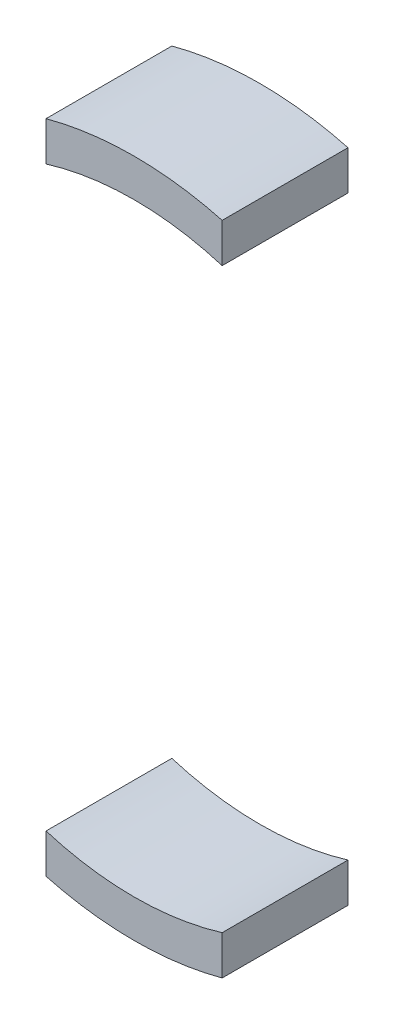
ISO-10303-21;
HEADER;
FILE_DESCRIPTION(('STEP AP214'),'2;1');
FILE_NAME('part.step','',(''),(''),'','','');
FILE_SCHEMA(('AUTOMOTIVE_DESIGN { 1 0 10303 214 1 1 1 1 }'));
ENDSEC;
DATA;
#1=APPLICATION_CONTEXT('core data for automotive mechanical design processes');
#2=APPLICATION_PROTOCOL_DEFINITION('international standard','automotive_design',2000,#1);
#3=PRODUCT_CONTEXT('',#1,'mechanical');
#4=PRODUCT('Part','Part','',(#3));
#5=PRODUCT_RELATED_PRODUCT_CATEGORY('part','',(#4));
#6=PRODUCT_DEFINITION_FORMATION('','',#4);
#7=PRODUCT_DEFINITION_CONTEXT('part definition',#1,'design');
#8=PRODUCT_DEFINITION('design','',#6,#7);
#9=PRODUCT_DEFINITION_SHAPE('','',#8);
#10=(LENGTH_UNIT() NAMED_UNIT(*) SI_UNIT(.MILLI.,.METRE.));
#11=(NAMED_UNIT(*) PLANE_ANGLE_UNIT() SI_UNIT($,.RADIAN.));
#12=(NAMED_UNIT(*) SI_UNIT($,.STERADIAN.) SOLID_ANGLE_UNIT());
#13=UNCERTAINTY_MEASURE_WITH_UNIT(LENGTH_MEASURE(1.E-05),#10,'distance_accuracy_value','');
#14=(GEOMETRIC_REPRESENTATION_CONTEXT(3) GLOBAL_UNCERTAINTY_ASSIGNED_CONTEXT((#13)) GLOBAL_UNIT_ASSIGNED_CONTEXT((#10,
#11,#12)) REPRESENTATION_CONTEXT('',''));
#15=CARTESIAN_POINT('',(0.,0.,0.));
#16=DIRECTION('',(0.,0.,1.));
#17=DIRECTION('',(1.,0.,0.));
#18=AXIS2_PLACEMENT_3D('',#15,#16,#17);
#19=CARTESIAN_POINT('',(0.,0.,2.5));
#20=DIRECTION('',(0.,0.,-1.));
#21=DIRECTION('',(-1.,0.,0.));
#22=AXIS2_PLACEMENT_3D('',#19,#20,#21);
#23=CYLINDRICAL_SURFACE('',#22,6.);
#24=CARTESIAN_POINT('',(0.,0.,0.));
#25=DIRECTION('',(0.,0.,-1.));
#26=DIRECTION('',(1.,0.,0.));
#27=AXIS2_PLACEMENT_3D('',#24,#25,#26);
#28=CIRCLE('',#27,6.);
#29=CARTESIAN_POINT('',(-1.75,5.7391201416245,0.));
#30=VERTEX_POINT('',#29);
#31=CARTESIAN_POINT('',(1.75,5.7391201416245,0.));
#32=VERTEX_POINT('',#31);
#33=EDGE_CURVE('E12',#30,#32,#28,.T.);
#34=ORIENTED_EDGE('',*,*,#33,.T.);
#35=DIRECTION('',(0.,0.,-1.));
#36=VECTOR('',#35,1.);
#37=CARTESIAN_POINT('',(1.75,5.7391201416245,2.5));
#38=LINE('',#37,#36);
#39=CARTESIAN_POINT('',(1.75,5.7391201416245,2.5));
#40=VERTEX_POINT('',#39);
#41=EDGE_CURVE('E135',#40,#32,#38,.T.);
#42=ORIENTED_EDGE('',*,*,#41,.F.);
#43=CARTESIAN_POINT('',(0.,0.,2.5));
#44=DIRECTION('',(0.,0.,-1.));
#45=DIRECTION('',(1.,0.,0.));
#46=AXIS2_PLACEMENT_3D('',#43,#44,#45);
#47=CIRCLE('',#46,6.);
#48=CARTESIAN_POINT('',(-1.75,5.7391201416245,2.5));
#49=VERTEX_POINT('',#48);
#50=EDGE_CURVE('E59',#49,#40,#47,.T.);
#51=ORIENTED_EDGE('',*,*,#50,.F.);
#52=DIRECTION('',(0.,0.,-1.));
#53=VECTOR('',#52,1.);
#54=CARTESIAN_POINT('',(-1.75,5.7391201416245,2.5));
#55=LINE('',#54,#53);
#56=EDGE_CURVE('E117',#49,#30,#55,.T.);
#57=ORIENTED_EDGE('',*,*,#56,.T.);
#58=EDGE_LOOP('',(#34,#42,#51,#57));
#59=FACE_BOUND('',#58,.T.);
#60=ADVANCED_FACE('F55',(#59),#23,.F.);
#61=CARTESIAN_POINT('',(1.75,6.51920240520265,2.5));
#62=DIRECTION('',(-1.,0.,0.));
#63=DIRECTION('',(0.,0.,1.));
#64=AXIS2_PLACEMENT_3D('',#61,#62,#63);
#65=PLANE('',#64);
#66=DIRECTION('',(0.,1.,0.));
#67=VECTOR('',#66,1.);
#68=CARTESIAN_POINT('',(1.75,6.51920240520265,0.));
#69=LINE('',#68,#67);
#70=CARTESIAN_POINT('',(1.75,6.51920240520265,0.));
#71=VERTEX_POINT('',#70);
#72=EDGE_CURVE('E66',#32,#71,#69,.T.);
#73=ORIENTED_EDGE('',*,*,#72,.T.);
#74=DIRECTION('',(0.,0.,-1.));
#75=VECTOR('',#74,1.);
#76=CARTESIAN_POINT('',(1.75,6.51920240520265,2.5));
#77=LINE('',#76,#75);
#78=CARTESIAN_POINT('',(1.75,6.51920240520265,2.5));
#79=VERTEX_POINT('',#78);
#80=EDGE_CURVE('E111',#79,#71,#77,.T.);
#81=ORIENTED_EDGE('',*,*,#80,.F.);
#82=DIRECTION('',(0.,1.,0.));
#83=VECTOR('',#82,1.);
#84=CARTESIAN_POINT('',(1.75,6.51920240520265,2.5));
#85=LINE('',#84,#83);
#86=EDGE_CURVE('E90',#40,#79,#85,.T.);
#87=ORIENTED_EDGE('',*,*,#86,.F.);
#88=ORIENTED_EDGE('',*,*,#41,.T.);
#89=EDGE_LOOP('',(#73,#81,#87,#88));
#90=FACE_BOUND('',#89,.T.);
#91=ADVANCED_FACE('F139',(#90),#65,.F.);
#92=CARTESIAN_POINT('',(0.,0.,2.5));
#93=DIRECTION('',(0.,0.,-1.));
#94=DIRECTION('',(-1.,0.,0.));
#95=AXIS2_PLACEMENT_3D('',#92,#93,#94);
#96=CYLINDRICAL_SURFACE('',#95,6.75);
#97=CARTESIAN_POINT('',(0.,0.,0.));
#98=DIRECTION('',(0.,0.,1.));
#99=DIRECTION('',(1.,0.,0.));
#100=AXIS2_PLACEMENT_3D('',#97,#98,#99);
#101=CIRCLE('',#100,6.75);
#102=CARTESIAN_POINT('',(-1.75,6.51920240520265,0.));
#103=VERTEX_POINT('',#102);
#104=EDGE_CURVE('E106',#71,#103,#101,.T.);
#105=ORIENTED_EDGE('',*,*,#104,.T.);
#106=DIRECTION('',(0.,0.,-1.));
#107=VECTOR('',#106,1.);
#108=CARTESIAN_POINT('',(-1.75,6.51920240520265,2.5));
#109=LINE('',#108,#107);
#110=CARTESIAN_POINT('',(-1.75,6.51920240520265,2.5));
#111=VERTEX_POINT('',#110);
#112=EDGE_CURVE('E109',#111,#103,#109,.T.);
#113=ORIENTED_EDGE('',*,*,#112,.F.);
#114=CARTESIAN_POINT('',(0.,0.,2.5));
#115=DIRECTION('',(0.,0.,1.));
#116=DIRECTION('',(1.,0.,0.));
#117=AXIS2_PLACEMENT_3D('',#114,#115,#116);
#118=CIRCLE('',#117,6.75);
#119=EDGE_CURVE('E129',#79,#111,#118,.T.);
#120=ORIENTED_EDGE('',*,*,#119,.F.);
#121=ORIENTED_EDGE('',*,*,#80,.T.);
#122=EDGE_LOOP('',(#105,#113,#120,#121));
#123=FACE_BOUND('',#122,.T.);
#124=ADVANCED_FACE('F107',(#123),#96,.T.);
#125=CARTESIAN_POINT('',(-1.75,6.51920240520265,2.5));
#126=DIRECTION('',(1.,0.,0.));
#127=DIRECTION('',(0.,0.,-1.));
#128=AXIS2_PLACEMENT_3D('',#125,#126,#127);
#129=PLANE('',#128);
#130=DIRECTION('',(0.,-1.,0.));
#131=VECTOR('',#130,1.);
#132=CARTESIAN_POINT('',(-1.75,6.51920240520265,0.));
#133=LINE('',#132,#131);
#134=EDGE_CURVE('E100',#103,#30,#133,.T.);
#135=ORIENTED_EDGE('',*,*,#134,.T.);
#136=ORIENTED_EDGE('',*,*,#56,.F.);
#137=DIRECTION('',(0.,-1.,0.));
#138=VECTOR('',#137,1.);
#139=CARTESIAN_POINT('',(-1.75,6.51920240520265,2.5));
#140=LINE('',#139,#138);
#141=EDGE_CURVE('E115',#111,#49,#140,.T.);
#142=ORIENTED_EDGE('',*,*,#141,.F.);
#143=ORIENTED_EDGE('',*,*,#112,.T.);
#144=EDGE_LOOP('',(#135,#136,#142,#143));
#145=FACE_BOUND('',#144,.T.);
#146=ADVANCED_FACE('F114',(#145),#129,.F.);
#147=CARTESIAN_POINT('',(0.,0.,2.5));
#148=DIRECTION('',(0.,0.,1.));
#149=DIRECTION('',(1.,0.,0.));
#150=AXIS2_PLACEMENT_3D('',#147,#148,#149);
#151=PLANE('',#150);
#152=ORIENTED_EDGE('',*,*,#50,.T.);
#153=ORIENTED_EDGE('',*,*,#86,.T.);
#154=ORIENTED_EDGE('',*,*,#119,.T.);
#155=ORIENTED_EDGE('',*,*,#141,.T.);
#156=EDGE_LOOP('',(#152,#153,#154,#155));
#157=FACE_BOUND('',#156,.T.);
#158=ADVANCED_FACE('F57',(#157),#151,.T.);
#159=CARTESIAN_POINT('',(0.,0.,0.));
#160=DIRECTION('',(0.,0.,1.));
#161=DIRECTION('',(1.,0.,0.));
#162=AXIS2_PLACEMENT_3D('',#159,#160,#161);
#163=PLANE('',#162);
#164=ORIENTED_EDGE('',*,*,#33,.F.);
#165=ORIENTED_EDGE('',*,*,#134,.F.);
#166=ORIENTED_EDGE('',*,*,#104,.F.);
#167=ORIENTED_EDGE('',*,*,#72,.F.);
#168=EDGE_LOOP('',(#164,#165,#166,#167));
#169=FACE_BOUND('',#168,.T.);
#170=ADVANCED_FACE('F119',(#169),#163,.F.);
#171=CLOSED_SHELL('',(#60,#91,#124,#146,#158,#170));
#172=MANIFOLD_SOLID_BREP('B2',#171);
#173=CARTESIAN_POINT('',(0.,0.,2.5));
#174=DIRECTION('',(0.,0.,-1.));
#175=DIRECTION('',(-1.,0.,0.));
#176=AXIS2_PLACEMENT_3D('',#173,#174,#175);
#177=CYLINDRICAL_SURFACE('',#176,6.);
#178=CARTESIAN_POINT('',(0.,0.,0.));
#179=DIRECTION('',(0.,0.,-1.));
#180=DIRECTION('',(1.,0.,0.));
#181=AXIS2_PLACEMENT_3D('',#178,#179,#180);
#182=CIRCLE('',#181,6.);
#183=CARTESIAN_POINT('',(1.75,-5.7391201416245,0.));
#184=VERTEX_POINT('',#183);
#185=CARTESIAN_POINT('',(-1.75,-5.7391201416245,0.));
#186=VERTEX_POINT('',#185);
#187=EDGE_CURVE('E254',#184,#186,#182,.T.);
#188=ORIENTED_EDGE('',*,*,#187,.T.);
#189=DIRECTION('',(0.,0.,-1.));
#190=VECTOR('',#189,1.);
#191=CARTESIAN_POINT('',(-1.75,-5.7391201416245,2.5));
#192=LINE('',#191,#190);
#193=CARTESIAN_POINT('',(-1.75,-5.7391201416245,2.5));
#194=VERTEX_POINT('',#193);
#195=EDGE_CURVE('E53',#194,#186,#192,.T.);
#196=ORIENTED_EDGE('',*,*,#195,.F.);
#197=CARTESIAN_POINT('',(0.,0.,2.5));
#198=DIRECTION('',(0.,0.,-1.));
#199=DIRECTION('',(1.,0.,0.));
#200=AXIS2_PLACEMENT_3D('',#197,#198,#199);
#201=CIRCLE('',#200,6.);
#202=CARTESIAN_POINT('',(1.75,-5.7391201416245,2.5));
#203=VERTEX_POINT('',#202);
#204=EDGE_CURVE('E242',#203,#194,#201,.T.);
#205=ORIENTED_EDGE('',*,*,#204,.F.);
#206=DIRECTION('',(0.,0.,-1.));
#207=VECTOR('',#206,1.);
#208=CARTESIAN_POINT('',(1.75,-5.7391201416245,2.5));
#209=LINE('',#208,#207);
#210=EDGE_CURVE('E250',#203,#184,#209,.T.);
#211=ORIENTED_EDGE('',*,*,#210,.T.);
#212=EDGE_LOOP('',(#188,#196,#205,#211));
#213=FACE_BOUND('',#212,.T.);
#214=ADVANCED_FACE('F191',(#213),#177,.F.);
#215=CARTESIAN_POINT('',(-1.75,-5.7391201416245,2.5));
#216=DIRECTION('',(1.,0.,0.));
#217=DIRECTION('',(0.,0.,-1.));
#218=AXIS2_PLACEMENT_3D('',#215,#216,#217);
#219=PLANE('',#218);
#220=DIRECTION('',(0.,-1.,0.));
#221=VECTOR('',#220,1.);
#222=CARTESIAN_POINT('',(-1.75,-5.7391201416245,0.));
#223=LINE('',#222,#221);
#224=CARTESIAN_POINT('',(-1.75,-6.51920240520265,0.));
#225=VERTEX_POINT('',#224);
#226=EDGE_CURVE('E246',#186,#225,#223,.T.);
#227=ORIENTED_EDGE('',*,*,#226,.T.);
#228=DIRECTION('',(0.,0.,-1.));
#229=VECTOR('',#228,1.);
#230=CARTESIAN_POINT('',(-1.75,-6.51920240520265,2.5));
#231=LINE('',#230,#229);
#232=CARTESIAN_POINT('',(-1.75,-6.51920240520265,2.5));
#233=VERTEX_POINT('',#232);
#234=EDGE_CURVE('E199',#233,#225,#231,.T.);
#235=ORIENTED_EDGE('',*,*,#234,.F.);
#236=DIRECTION('',(0.,-1.,0.));
#237=VECTOR('',#236,1.);
#238=CARTESIAN_POINT('',(-1.75,-5.7391201416245,2.5));
#239=LINE('',#238,#237);
#240=EDGE_CURVE('E237',#194,#233,#239,.T.);
#241=ORIENTED_EDGE('',*,*,#240,.F.);
#242=ORIENTED_EDGE('',*,*,#195,.T.);
#243=EDGE_LOOP('',(#227,#235,#241,#242));
#244=FACE_BOUND('',#243,.T.);
#245=ADVANCED_FACE('F245',(#244),#219,.F.);
#246=CARTESIAN_POINT('',(0.,0.,2.5));
#247=DIRECTION('',(0.,0.,-1.));
#248=DIRECTION('',(-1.,0.,0.));
#249=AXIS2_PLACEMENT_3D('',#246,#247,#248);
#250=CYLINDRICAL_SURFACE('',#249,6.75);
#251=CARTESIAN_POINT('',(0.,0.,0.));
#252=DIRECTION('',(0.,0.,1.));
#253=DIRECTION('',(1.,0.,0.));
#254=AXIS2_PLACEMENT_3D('',#251,#252,#253);
#255=CIRCLE('',#254,6.75);
#256=CARTESIAN_POINT('',(1.75,-6.51920240520265,0.));
#257=VERTEX_POINT('',#256);
#258=EDGE_CURVE('E224',#225,#257,#255,.T.);
#259=ORIENTED_EDGE('',*,*,#258,.T.);
#260=DIRECTION('',(0.,0.,-1.));
#261=VECTOR('',#260,1.);
#262=CARTESIAN_POINT('',(1.75,-6.51920240520265,2.5));
#263=LINE('',#262,#261);
#264=CARTESIAN_POINT('',(1.75,-6.51920240520265,2.5));
#265=VERTEX_POINT('',#264);
#266=EDGE_CURVE('E247',#265,#257,#263,.T.);
#267=ORIENTED_EDGE('',*,*,#266,.F.);
#268=CARTESIAN_POINT('',(0.,0.,2.5));
#269=DIRECTION('',(0.,0.,1.));
#270=DIRECTION('',(1.,0.,0.));
#271=AXIS2_PLACEMENT_3D('',#268,#269,#270);
#272=CIRCLE('',#271,6.75);
#273=EDGE_CURVE('E240',#233,#265,#272,.T.);
#274=ORIENTED_EDGE('',*,*,#273,.F.);
#275=ORIENTED_EDGE('',*,*,#234,.T.);
#276=EDGE_LOOP('',(#259,#267,#274,#275));
#277=FACE_BOUND('',#276,.T.);
#278=ADVANCED_FACE('F248',(#277),#250,.T.);
#279=CARTESIAN_POINT('',(1.75,-5.7391201416245,2.5));
#280=DIRECTION('',(-1.,0.,0.));
#281=DIRECTION('',(0.,0.,1.));
#282=AXIS2_PLACEMENT_3D('',#279,#280,#281);
#283=PLANE('',#282);
#284=DIRECTION('',(0.,1.,0.));
#285=VECTOR('',#284,1.);
#286=CARTESIAN_POINT('',(1.75,-5.7391201416245,0.));
#287=LINE('',#286,#285);
#288=EDGE_CURVE('E230',#257,#184,#287,.T.);
#289=ORIENTED_EDGE('',*,*,#288,.T.);
#290=ORIENTED_EDGE('',*,*,#210,.F.);
#291=DIRECTION('',(0.,1.,0.));
#292=VECTOR('',#291,1.);
#293=CARTESIAN_POINT('',(1.75,-5.7391201416245,2.5));
#294=LINE('',#293,#292);
#295=EDGE_CURVE('E207',#265,#203,#294,.T.);
#296=ORIENTED_EDGE('',*,*,#295,.F.);
#297=ORIENTED_EDGE('',*,*,#266,.T.);
#298=EDGE_LOOP('',(#289,#290,#296,#297));
#299=FACE_BOUND('',#298,.T.);
#300=ADVANCED_FACE('F261',(#299),#283,.F.);
#301=CARTESIAN_POINT('',(0.,0.,2.5));
#302=DIRECTION('',(0.,0.,1.));
#303=DIRECTION('',(1.,0.,0.));
#304=AXIS2_PLACEMENT_3D('',#301,#302,#303);
#305=PLANE('',#304);
#306=ORIENTED_EDGE('',*,*,#204,.T.);
#307=ORIENTED_EDGE('',*,*,#240,.T.);
#308=ORIENTED_EDGE('',*,*,#273,.T.);
#309=ORIENTED_EDGE('',*,*,#295,.T.);
#310=EDGE_LOOP('',(#306,#307,#308,#309));
#311=FACE_BOUND('',#310,.T.);
#312=ADVANCED_FACE('F238',(#311),#305,.T.);
#313=CARTESIAN_POINT('',(0.,0.,0.));
#314=DIRECTION('',(0.,0.,1.));
#315=DIRECTION('',(1.,0.,0.));
#316=AXIS2_PLACEMENT_3D('',#313,#314,#315);
#317=PLANE('',#316);
#318=ORIENTED_EDGE('',*,*,#187,.F.);
#319=ORIENTED_EDGE('',*,*,#288,.F.);
#320=ORIENTED_EDGE('',*,*,#258,.F.);
#321=ORIENTED_EDGE('',*,*,#226,.F.);
#322=EDGE_LOOP('',(#318,#319,#320,#321));
#323=FACE_BOUND('',#322,.T.);
#324=ADVANCED_FACE('F264',(#323),#317,.F.);
#325=CLOSED_SHELL('',(#214,#245,#278,#300,#312,#324));
#326=MANIFOLD_SOLID_BREP('B6',#325);
#327=ADVANCED_BREP_SHAPE_REPRESENTATION('',(#18,#172,#326),#14);
#328=SHAPE_DEFINITION_REPRESENTATION(#9,#327);
ENDSEC;
END-ISO-10303-21;
